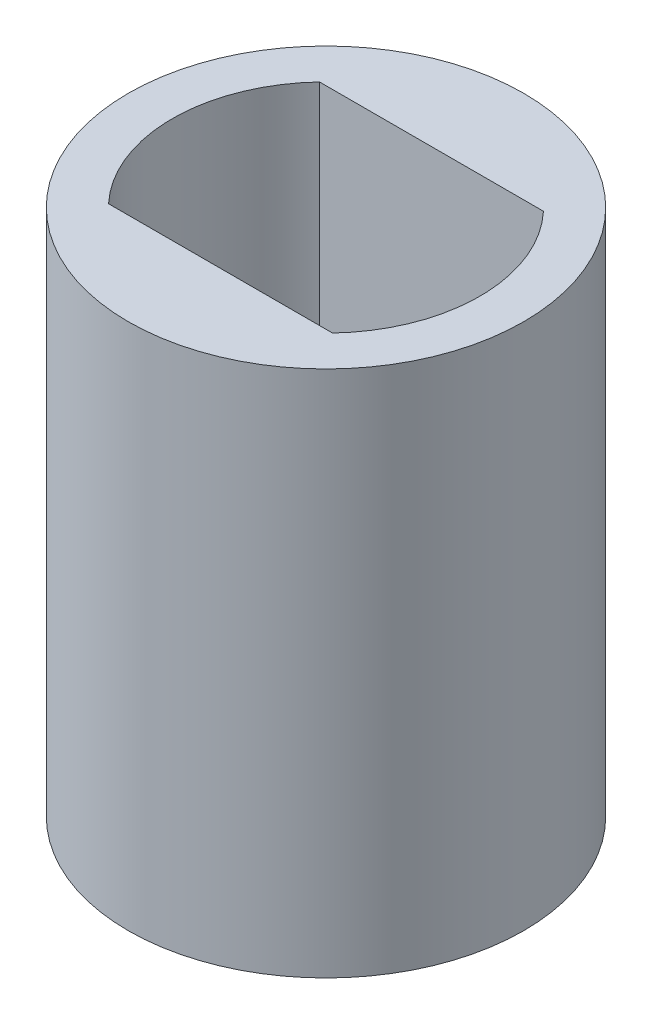
ISO-10303-21;
HEADER;
FILE_DESCRIPTION(('STEP AP214'),'2;1');
FILE_NAME('part.step','',(''),(''),'','','');
FILE_SCHEMA(('AUTOMOTIVE_DESIGN { 1 0 10303 214 1 1 1 1 }'));
ENDSEC;
DATA;
#1=APPLICATION_CONTEXT('core data for automotive mechanical design processes');
#2=APPLICATION_PROTOCOL_DEFINITION('international standard','automotive_design',2000,#1);
#3=PRODUCT_CONTEXT('',#1,'mechanical');
#4=PRODUCT('Part','Part','',(#3));
#5=PRODUCT_RELATED_PRODUCT_CATEGORY('part','',(#4));
#6=PRODUCT_DEFINITION_FORMATION('','',#4);
#7=PRODUCT_DEFINITION_CONTEXT('part definition',#1,'design');
#8=PRODUCT_DEFINITION('design','',#6,#7);
#9=PRODUCT_DEFINITION_SHAPE('','',#8);
#10=(LENGTH_UNIT() NAMED_UNIT(*) SI_UNIT(.MILLI.,.METRE.));
#11=(NAMED_UNIT(*) PLANE_ANGLE_UNIT() SI_UNIT($,.RADIAN.));
#12=(NAMED_UNIT(*) SI_UNIT($,.STERADIAN.) SOLID_ANGLE_UNIT());
#13=UNCERTAINTY_MEASURE_WITH_UNIT(LENGTH_MEASURE(1.E-05),#10,'distance_accuracy_value','');
#14=(GEOMETRIC_REPRESENTATION_CONTEXT(3) GLOBAL_UNCERTAINTY_ASSIGNED_CONTEXT((#13)) GLOBAL_UNIT_ASSIGNED_CONTEXT((#10,
#11,#12)) REPRESENTATION_CONTEXT('',''));
#15=CARTESIAN_POINT('',(0.,0.,0.));
#16=DIRECTION('',(0.,0.,1.));
#17=DIRECTION('',(1.,0.,0.));
#18=AXIS2_PLACEMENT_3D('',#15,#16,#17);
#19=CARTESIAN_POINT('',(0.,10.,0.));
#20=DIRECTION('',(0.,1.,0.));
#21=DIRECTION('',(0.,0.,1.));
#22=AXIS2_PLACEMENT_3D('',#19,#20,#21);
#23=PLANE('',#22);
#24=DIRECTION('',(-1.,0.,0.));
#25=VECTOR('',#24,1.);
#26=CARTESIAN_POINT('',(-2.5475478405714,10.,-2.4));
#27=LINE('',#26,#25);
#28=CARTESIAN_POINT('',(2.5475478405714,10.,-2.4));
#29=VERTEX_POINT('',#28);
#30=CARTESIAN_POINT('',(0.700000000000001,10.,-2.4));
#31=VERTEX_POINT('',#30);
#32=EDGE_CURVE('E104',#29,#31,#27,.T.);
#33=ORIENTED_EDGE('',*,*,#32,.T.);
#34=CARTESIAN_POINT('',(0.,10.,0.));
#35=DIRECTION('',(0.,-1.,0.));
#36=DIRECTION('',(0.,0.,-1.));
#37=AXIS2_PLACEMENT_3D('',#34,#35,#36);
#38=CIRCLE('',#37,2.5);
#39=CARTESIAN_POINT('',(0.700000000000001,10.,2.4));
#40=VERTEX_POINT('',#39);
#41=EDGE_CURVE('E89',#31,#40,#38,.T.);
#42=ORIENTED_EDGE('',*,*,#41,.T.);
#43=DIRECTION('',(1.,0.,0.));
#44=VECTOR('',#43,1.);
#45=CARTESIAN_POINT('',(-2.5475478405714,10.,2.4));
#46=LINE('',#45,#44);
#47=CARTESIAN_POINT('',(2.5475478405714,10.,2.4));
#48=VERTEX_POINT('',#47);
#49=EDGE_CURVE('E122',#40,#48,#46,.T.);
#50=ORIENTED_EDGE('',*,*,#49,.T.);
#51=CARTESIAN_POINT('',(0.,10.,0.));
#52=DIRECTION('',(0.,1.,0.));
#53=DIRECTION('',(0.,0.,-1.));
#54=AXIS2_PLACEMENT_3D('',#51,#52,#53);
#55=CIRCLE('',#54,3.50000000000001);
#56=EDGE_CURVE('E110',#48,#29,#55,.T.);
#57=ORIENTED_EDGE('',*,*,#56,.T.);
#58=EDGE_LOOP('',(#33,#42,#50,#57));
#59=FACE_BOUND('',#58,.T.);
#60=ADVANCED_FACE('F31',(#59),#23,.T.);
#61=CARTESIAN_POINT('',(-2.5475478405714,10.,2.4));
#62=VERTEX_POINT('',#61);
#63=CARTESIAN_POINT('',(-0.700000000000001,10.,2.4));
#64=VERTEX_POINT('',#63);
#65=EDGE_CURVE('E118',#62,#64,#46,.T.);
#66=ORIENTED_EDGE('',*,*,#65,.T.);
#67=CARTESIAN_POINT('',(-0.700000000000001,10.,-2.4));
#68=VERTEX_POINT('',#67);
#69=EDGE_CURVE('E86',#64,#68,#38,.T.);
#70=ORIENTED_EDGE('',*,*,#69,.T.);
#71=CARTESIAN_POINT('',(-2.5475478405714,10.,-2.4));
#72=VERTEX_POINT('',#71);
#73=EDGE_CURVE('E106',#68,#72,#27,.T.);
#74=ORIENTED_EDGE('',*,*,#73,.T.);
#75=CARTESIAN_POINT('',(0.,10.,0.));
#76=DIRECTION('',(0.,1.,0.));
#77=DIRECTION('',(0.,0.,1.));
#78=AXIS2_PLACEMENT_3D('',#75,#76,#77);
#79=CIRCLE('',#78,3.50000000000001);
#80=EDGE_CURVE('E124',#72,#62,#79,.T.);
#81=ORIENTED_EDGE('',*,*,#80,.T.);
#82=EDGE_LOOP('',(#66,#70,#74,#81));
#83=FACE_BOUND('',#82,.T.);
#84=ADVANCED_FACE('F162',(#83),#23,.T.);
#85=CARTESIAN_POINT('',(0.,15.,0.));
#86=DIRECTION('',(0.,-1.,0.));
#87=DIRECTION('',(0.,0.,-1.));
#88=AXIS2_PLACEMENT_3D('',#85,#86,#87);
#89=CYLINDRICAL_SURFACE('',#88,4.5);
#90=CARTESIAN_POINT('',(0.,15.,0.));
#91=DIRECTION('',(0.,1.,0.));
#92=DIRECTION('',(0.,0.,1.));
#93=AXIS2_PLACEMENT_3D('',#90,#91,#92);
#94=CIRCLE('',#93,4.5);
#95=CARTESIAN_POINT('',(0.,15.,4.5));
#96=VERTEX_POINT('',#95);
#97=EDGE_CURVE('E11',#96,#96,#94,.T.);
#98=ORIENTED_EDGE('',*,*,#97,.F.);
#99=EDGE_LOOP('',(#98));
#100=FACE_BOUND('',#99,.T.);
#101=CARTESIAN_POINT('',(0.,3.,0.));
#102=DIRECTION('',(0.,1.,0.));
#103=DIRECTION('',(0.,0.,1.));
#104=AXIS2_PLACEMENT_3D('',#101,#102,#103);
#105=CIRCLE('',#104,4.5);
#106=CARTESIAN_POINT('',(0.,3.,4.5));
#107=VERTEX_POINT('',#106);
#108=EDGE_CURVE('E35',#107,#107,#105,.T.);
#109=ORIENTED_EDGE('',*,*,#108,.T.);
#110=EDGE_LOOP('',(#109));
#111=FACE_BOUND('',#110,.T.);
#112=ADVANCED_FACE('F33',(#100,#111),#89,.T.);
#113=CARTESIAN_POINT('',(0.,15.,0.));
#114=DIRECTION('',(0.,1.,0.));
#115=DIRECTION('',(0.,0.,1.));
#116=AXIS2_PLACEMENT_3D('',#113,#114,#115);
#117=PLANE('',#116);
#118=CARTESIAN_POINT('',(0.,15.,0.));
#119=DIRECTION('',(0.,1.,0.));
#120=DIRECTION('',(0.,0.,1.));
#121=AXIS2_PLACEMENT_3D('',#118,#119,#120);
#122=CIRCLE('',#121,3.50000000000001);
#123=CARTESIAN_POINT('',(-2.5475478405714,15.,-2.4));
#124=VERTEX_POINT('',#123);
#125=CARTESIAN_POINT('',(-2.5475478405714,15.,2.4));
#126=VERTEX_POINT('',#125);
#127=EDGE_CURVE('E54',#124,#126,#122,.T.);
#128=ORIENTED_EDGE('',*,*,#127,.F.);
#129=DIRECTION('',(-1.,0.,0.));
#130=VECTOR('',#129,1.);
#131=CARTESIAN_POINT('',(-2.5475478405714,15.,-2.4));
#132=LINE('',#131,#130);
#133=CARTESIAN_POINT('',(2.5475478405714,15.,-2.4));
#134=VERTEX_POINT('',#133);
#135=EDGE_CURVE('E126',#134,#124,#132,.T.);
#136=ORIENTED_EDGE('',*,*,#135,.F.);
#137=CARTESIAN_POINT('',(0.,15.,0.));
#138=DIRECTION('',(0.,1.,0.));
#139=DIRECTION('',(0.,0.,-1.));
#140=AXIS2_PLACEMENT_3D('',#137,#138,#139);
#141=CIRCLE('',#140,3.50000000000001);
#142=CARTESIAN_POINT('',(2.5475478405714,15.,2.4));
#143=VERTEX_POINT('',#142);
#144=EDGE_CURVE('E152',#143,#134,#141,.T.);
#145=ORIENTED_EDGE('',*,*,#144,.F.);
#146=DIRECTION('',(1.,0.,0.));
#147=VECTOR('',#146,1.);
#148=CARTESIAN_POINT('',(-2.5475478405714,15.,2.4));
#149=LINE('',#148,#147);
#150=EDGE_CURVE('E156',#126,#143,#149,.T.);
#151=ORIENTED_EDGE('',*,*,#150,.F.);
#152=EDGE_LOOP('',(#128,#136,#145,#151));
#153=FACE_BOUND('',#152,.T.);
#154=ORIENTED_EDGE('',*,*,#97,.T.);
#155=EDGE_LOOP('',(#154));
#156=FACE_BOUND('',#155,.T.);
#157=ADVANCED_FACE('F134',(#153,#156),#117,.T.);
#158=CARTESIAN_POINT('',(0.,3.,0.));
#159=DIRECTION('',(0.,1.,0.));
#160=DIRECTION('',(0.,0.,1.));
#161=AXIS2_PLACEMENT_3D('',#158,#159,#160);
#162=PLANE('',#161);
#163=CARTESIAN_POINT('',(0.,3.,0.));
#164=DIRECTION('',(0.,-1.,0.));
#165=DIRECTION('',(0.,0.,-1.));
#166=AXIS2_PLACEMENT_3D('',#163,#164,#165);
#167=CIRCLE('',#166,2.5);
#168=CARTESIAN_POINT('',(0.,3.,-2.5));
#169=VERTEX_POINT('',#168);
#170=EDGE_CURVE('E87',#169,#169,#167,.T.);
#171=ORIENTED_EDGE('',*,*,#170,.F.);
#172=EDGE_LOOP('',(#171));
#173=FACE_BOUND('',#172,.T.);
#174=ORIENTED_EDGE('',*,*,#108,.F.);
#175=EDGE_LOOP('',(#174));
#176=FACE_BOUND('',#175,.T.);
#177=ADVANCED_FACE('F130',(#173,#176),#162,.F.);
#178=CARTESIAN_POINT('',(0.,10.,0.));
#179=DIRECTION('',(0.,1.,0.));
#180=DIRECTION('',(0.,0.,1.));
#181=AXIS2_PLACEMENT_3D('',#178,#179,#180);
#182=CYLINDRICAL_SURFACE('',#181,3.50000000000001);
#183=ORIENTED_EDGE('',*,*,#127,.T.);
#184=DIRECTION('',(0.,1.,0.));
#185=VECTOR('',#184,1.);
#186=CARTESIAN_POINT('',(-2.5475478405714,10.,2.4));
#187=LINE('',#186,#185);
#188=EDGE_CURVE('E111',#62,#126,#187,.T.);
#189=ORIENTED_EDGE('',*,*,#188,.F.);
#190=ORIENTED_EDGE('',*,*,#80,.F.);
#191=DIRECTION('',(0.,1.,0.));
#192=VECTOR('',#191,1.);
#193=CARTESIAN_POINT('',(-2.5475478405714,10.,-2.4));
#194=LINE('',#193,#192);
#195=EDGE_CURVE('E138',#72,#124,#194,.T.);
#196=ORIENTED_EDGE('',*,*,#195,.T.);
#197=EDGE_LOOP('',(#183,#189,#190,#196));
#198=FACE_BOUND('',#197,.T.);
#199=ADVANCED_FACE('F133',(#198),#182,.F.);
#200=CARTESIAN_POINT('',(-2.5475478405714,10.,-2.4));
#201=DIRECTION('',(0.,0.,-1.));
#202=DIRECTION('',(-1.,0.,0.));
#203=AXIS2_PLACEMENT_3D('',#200,#201,#202);
#204=PLANE('',#203);
#205=ORIENTED_EDGE('',*,*,#135,.T.);
#206=ORIENTED_EDGE('',*,*,#195,.F.);
#207=ORIENTED_EDGE('',*,*,#73,.F.);
#208=EDGE_CURVE('E84',#31,#68,#27,.T.);
#209=ORIENTED_EDGE('',*,*,#208,.F.);
#210=ORIENTED_EDGE('',*,*,#32,.F.);
#211=DIRECTION('',(0.,1.,0.));
#212=VECTOR('',#211,1.);
#213=CARTESIAN_POINT('',(2.5475478405714,10.,-2.4));
#214=LINE('',#213,#212);
#215=EDGE_CURVE('E139',#29,#134,#214,.T.);
#216=ORIENTED_EDGE('',*,*,#215,.T.);
#217=EDGE_LOOP('',(#205,#206,#207,#209,#210,#216));
#218=FACE_BOUND('',#217,.T.);
#219=ADVANCED_FACE('F103',(#218),#204,.F.);
#220=CARTESIAN_POINT('',(0.,10.,0.));
#221=DIRECTION('',(0.,1.,0.));
#222=DIRECTION('',(0.,0.,1.));
#223=AXIS2_PLACEMENT_3D('',#220,#221,#222);
#224=CYLINDRICAL_SURFACE('',#223,3.50000000000001);
#225=ORIENTED_EDGE('',*,*,#144,.T.);
#226=ORIENTED_EDGE('',*,*,#215,.F.);
#227=ORIENTED_EDGE('',*,*,#56,.F.);
#228=DIRECTION('',(0.,1.,0.));
#229=VECTOR('',#228,1.);
#230=CARTESIAN_POINT('',(2.5475478405714,10.,2.4));
#231=LINE('',#230,#229);
#232=EDGE_CURVE('E112',#48,#143,#231,.T.);
#233=ORIENTED_EDGE('',*,*,#232,.T.);
#234=EDGE_LOOP('',(#225,#226,#227,#233));
#235=FACE_BOUND('',#234,.T.);
#236=ADVANCED_FACE('F150',(#235),#224,.F.);
#237=CARTESIAN_POINT('',(-2.5475478405714,10.,2.4));
#238=DIRECTION('',(0.,0.,1.));
#239=DIRECTION('',(1.,0.,0.));
#240=AXIS2_PLACEMENT_3D('',#237,#238,#239);
#241=PLANE('',#240);
#242=ORIENTED_EDGE('',*,*,#150,.T.);
#243=ORIENTED_EDGE('',*,*,#232,.F.);
#244=ORIENTED_EDGE('',*,*,#49,.F.);
#245=EDGE_CURVE('E120',#64,#40,#46,.T.);
#246=ORIENTED_EDGE('',*,*,#245,.F.);
#247=ORIENTED_EDGE('',*,*,#65,.F.);
#248=ORIENTED_EDGE('',*,*,#188,.T.);
#249=EDGE_LOOP('',(#242,#243,#244,#246,#247,#248));
#250=FACE_BOUND('',#249,.T.);
#251=ADVANCED_FACE('F157',(#250),#241,.F.);
#252=CARTESIAN_POINT('',(0.,10.,0.));
#253=DIRECTION('',(0.,-1.,0.));
#254=DIRECTION('',(0.,0.,-1.));
#255=AXIS2_PLACEMENT_3D('',#252,#253,#254);
#256=PLANE('',#255);
#257=ORIENTED_EDGE('',*,*,#245,.T.);
#258=EDGE_CURVE('E95',#40,#64,#38,.T.);
#259=ORIENTED_EDGE('',*,*,#258,.T.);
#260=EDGE_LOOP('',(#257,#259));
#261=FACE_BOUND('',#260,.T.);
#262=ADVANCED_FACE('F165',(#261),#256,.T.);
#263=ORIENTED_EDGE('',*,*,#208,.T.);
#264=EDGE_CURVE('E46',#68,#31,#38,.T.);
#265=ORIENTED_EDGE('',*,*,#264,.T.);
#266=EDGE_LOOP('',(#263,#265));
#267=FACE_BOUND('',#266,.T.);
#268=ADVANCED_FACE('F82',(#267),#256,.T.);
#269=CARTESIAN_POINT('',(0.,10.,0.));
#270=DIRECTION('',(0.,-1.,0.));
#271=DIRECTION('',(0.,0.,-1.));
#272=AXIS2_PLACEMENT_3D('',#269,#270,#271);
#273=CYLINDRICAL_SURFACE('',#272,2.5);
#274=ORIENTED_EDGE('',*,*,#41,.F.);
#275=ORIENTED_EDGE('',*,*,#264,.F.);
#276=ORIENTED_EDGE('',*,*,#69,.F.);
#277=ORIENTED_EDGE('',*,*,#258,.F.);
#278=EDGE_LOOP('',(#274,#275,#276,#277));
#279=FACE_BOUND('',#278,.T.);
#280=ORIENTED_EDGE('',*,*,#170,.T.);
#281=EDGE_LOOP('',(#280));
#282=FACE_BOUND('',#281,.T.);
#283=ADVANCED_FACE('F92',(#279,#282),#273,.F.);
#284=CLOSED_SHELL('',(#60,#84,#112,#157,#177,#199,#219,#236,#251,#262,#268,#283));
#285=MANIFOLD_SOLID_BREP('B2',#284);
#286=ADVANCED_BREP_SHAPE_REPRESENTATION('',(#18,#285),#14);
#287=SHAPE_DEFINITION_REPRESENTATION(#9,#286);
ENDSEC;
END-ISO-10303-21;
